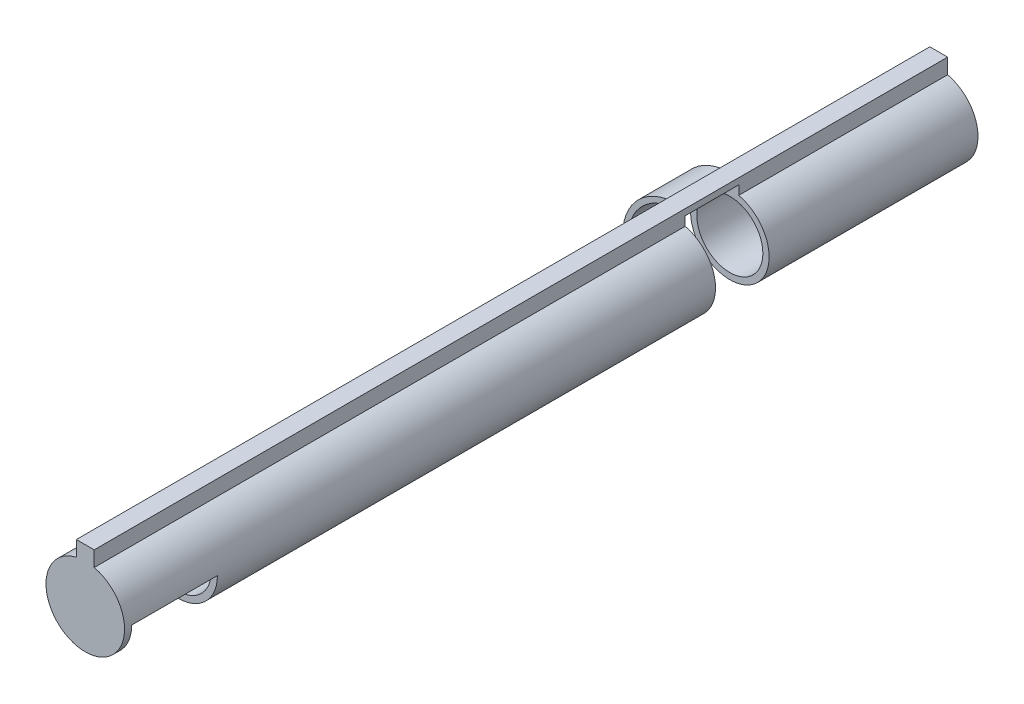
ISO-10303-21;
HEADER;
FILE_DESCRIPTION(('STEP AP214'),'2;1');
FILE_NAME('part.step','',(''),(''),'','','');
FILE_SCHEMA(('AUTOMOTIVE_DESIGN { 1 0 10303 214 1 1 1 1 }'));
ENDSEC;
DATA;
#1=APPLICATION_CONTEXT('core data for automotive mechanical design processes');
#2=APPLICATION_PROTOCOL_DEFINITION('international standard','automotive_design',2000,#1);
#3=PRODUCT_CONTEXT('',#1,'mechanical');
#4=PRODUCT('Part','Part','',(#3));
#5=PRODUCT_RELATED_PRODUCT_CATEGORY('part','',(#4));
#6=PRODUCT_DEFINITION_FORMATION('','',#4);
#7=PRODUCT_DEFINITION_CONTEXT('part definition',#1,'design');
#8=PRODUCT_DEFINITION('design','',#6,#7);
#9=PRODUCT_DEFINITION_SHAPE('','',#8);
#10=(LENGTH_UNIT() NAMED_UNIT(*) SI_UNIT(.MILLI.,.METRE.));
#11=(NAMED_UNIT(*) PLANE_ANGLE_UNIT() SI_UNIT($,.RADIAN.));
#12=(NAMED_UNIT(*) SI_UNIT($,.STERADIAN.) SOLID_ANGLE_UNIT());
#13=UNCERTAINTY_MEASURE_WITH_UNIT(LENGTH_MEASURE(1.E-05),#10,'distance_accuracy_value','');
#14=(GEOMETRIC_REPRESENTATION_CONTEXT(3) GLOBAL_UNCERTAINTY_ASSIGNED_CONTEXT((#13)) GLOBAL_UNIT_ASSIGNED_CONTEXT((#10,
#11,#12)) REPRESENTATION_CONTEXT('',''));
#15=CARTESIAN_POINT('',(0.,0.,0.));
#16=DIRECTION('',(0.,0.,1.));
#17=DIRECTION('',(1.,0.,0.));
#18=AXIS2_PLACEMENT_3D('',#15,#16,#17);
#19=CARTESIAN_POINT('',(0.,0.,213.));
#20=DIRECTION('',(0.,0.,1.));
#21=DIRECTION('',(1.,0.,0.));
#22=AXIS2_PLACEMENT_3D('',#19,#20,#21);
#23=PLANE('',#22);
#24=CARTESIAN_POINT('',(0.,0.,213.));
#25=DIRECTION('',(0.,0.,1.));
#26=DIRECTION('',(1.,0.,0.));
#27=AXIS2_PLACEMENT_3D('',#24,#25,#26);
#28=CIRCLE('',#27,6.5);
#29=CARTESIAN_POINT('',(5.61707828518173,3.27084569158189,213.));
#30=VERTEX_POINT('',#29);
#31=CARTESIAN_POINT('',(-3.27084569158189,-5.61707828518173,213.));
#32=VERTEX_POINT('',#31);
#33=EDGE_CURVE('E234',#30,#32,#28,.T.);
#34=ORIENTED_EDGE('',*,*,#33,.F.);
#35=CARTESIAN_POINT('',(12.5304054054054,7.29650192737499,213.));
#36=DIRECTION('',(0.,0.,1.));
#37=DIRECTION('',(1.,0.,0.));
#38=AXIS2_PLACEMENT_3D('',#35,#36,#37);
#39=CIRCLE('',#38,8.);
#40=CARTESIAN_POINT('',(9.25,0.,213.));
#41=VERTEX_POINT('',#40);
#42=EDGE_CURVE('E11',#30,#41,#39,.T.);
#43=ORIENTED_EDGE('',*,*,#42,.T.);
#44=CARTESIAN_POINT('',(0.,0.,213.));
#45=DIRECTION('',(0.,0.,1.));
#46=DIRECTION('',(1.,0.,0.));
#47=AXIS2_PLACEMENT_3D('',#44,#45,#46);
#48=CIRCLE('',#47,9.25);
#49=CARTESIAN_POINT('',(0.,-9.25,213.));
#50=VERTEX_POINT('',#49);
#51=EDGE_CURVE('E183',#41,#50,#48,.T.);
#52=ORIENTED_EDGE('',*,*,#51,.T.);
#53=CARTESIAN_POINT('',(-7.29650192737499,-12.5304054054054,213.));
#54=DIRECTION('',(0.,0.,1.));
#55=DIRECTION('',(1.,0.,0.));
#56=AXIS2_PLACEMENT_3D('',#53,#54,#55);
#57=CIRCLE('',#56,8.);
#58=EDGE_CURVE('E42',#50,#32,#57,.T.);
#59=ORIENTED_EDGE('',*,*,#58,.T.);
#60=EDGE_LOOP('',(#34,#43,#52,#59));
#61=FACE_BOUND('',#60,.T.);
#62=ADVANCED_FACE('F34',(#61),#23,.T.);
#63=CARTESIAN_POINT('',(-2.5,10.7121426428143,245.58678379147));
#64=DIRECTION('',(1.,0.,0.));
#65=DIRECTION('',(0.,0.,-1.));
#66=AXIS2_PLACEMENT_3D('',#63,#64,#65);
#67=PLANE('',#66);
#68=DIRECTION('',(0.,-1.,0.));
#69=VECTOR('',#68,1.);
#70=CARTESIAN_POINT('',(-2.5,10.7121426428143,58.5));
#71=LINE('',#70,#69);
#72=CARTESIAN_POINT('',(-2.5,14.790199457749,58.5));
#73=VERTEX_POINT('',#72);
#74=CARTESIAN_POINT('',(-2.5,13.2664991614216,58.5));
#75=VERTEX_POINT('',#74);
#76=EDGE_CURVE('E314',#73,#75,#71,.T.);
#77=ORIENTED_EDGE('',*,*,#76,.F.);
#78=DIRECTION('',(0.,0.,1.));
#79=VECTOR('',#78,1.);
#80=CARTESIAN_POINT('',(-2.5,14.790199457749,58.5));
#81=LINE('',#80,#79);
#82=CARTESIAN_POINT('',(-2.5,14.790199457749,73.5));
#83=VERTEX_POINT('',#82);
#84=EDGE_CURVE('E310',#73,#83,#81,.T.);
#85=ORIENTED_EDGE('',*,*,#84,.T.);
#86=DIRECTION('',(0.,-1.,0.));
#87=VECTOR('',#86,1.);
#88=CARTESIAN_POINT('',(-2.5,10.7121426428143,73.5));
#89=LINE('',#88,#87);
#90=CARTESIAN_POINT('',(-2.5,13.2664991614216,73.5));
#91=VERTEX_POINT('',#90);
#92=EDGE_CURVE('E317',#83,#91,#89,.T.);
#93=ORIENTED_EDGE('',*,*,#92,.T.);
#94=DIRECTION('',(0.,-1.,0.));
#95=VECTOR('',#94,1.);
#96=CARTESIAN_POINT('',(-2.5,10.7121426428143,73.5));
#97=LINE('',#96,#95);
#98=CARTESIAN_POINT('',(-2.5,10.7121426428143,73.5));
#99=VERTEX_POINT('',#98);
#100=EDGE_CURVE('E301',#91,#99,#97,.T.);
#101=ORIENTED_EDGE('',*,*,#100,.T.);
#102=DIRECTION('',(0.,0.,-1.));
#103=VECTOR('',#102,1.);
#104=CARTESIAN_POINT('',(-2.5,10.7121426428143,245.58678379147));
#105=LINE('',#104,#103);
#106=CARTESIAN_POINT('',(-2.5,10.7121426428143,239.));
#107=VERTEX_POINT('',#106);
#108=EDGE_CURVE('E270',#107,#99,#105,.T.);
#109=ORIENTED_EDGE('',*,*,#108,.F.);
#110=DIRECTION('',(0.,-1.,0.));
#111=VECTOR('',#110,1.);
#112=CARTESIAN_POINT('',(-2.5,10.7121426428143,239.));
#113=LINE('',#112,#111);
#114=CARTESIAN_POINT('',(-2.5,15.,239.));
#115=VERTEX_POINT('',#114);
#116=EDGE_CURVE('E261',#115,#107,#113,.T.);
#117=ORIENTED_EDGE('',*,*,#116,.F.);
#118=DIRECTION('',(0.,0.,-1.));
#119=VECTOR('',#118,1.);
#120=CARTESIAN_POINT('',(-2.5,15.,245.58678379147));
#121=LINE('',#120,#119);
#122=CARTESIAN_POINT('',(-2.5,15.,0.));
#123=VERTEX_POINT('',#122);
#124=EDGE_CURVE('E274',#115,#123,#121,.T.);
#125=ORIENTED_EDGE('',*,*,#124,.T.);
#126=DIRECTION('',(0.,-1.,0.));
#127=VECTOR('',#126,1.);
#128=CARTESIAN_POINT('',(-2.5,10.7121426428143,0.));
#129=LINE('',#128,#127);
#130=CARTESIAN_POINT('',(-2.5,10.7121426428143,0.));
#131=VERTEX_POINT('',#130);
#132=EDGE_CURVE('E276',#123,#131,#129,.T.);
#133=ORIENTED_EDGE('',*,*,#132,.T.);
#134=CARTESIAN_POINT('',(-2.5,10.7121426428143,58.5));
#135=VERTEX_POINT('',#134);
#136=EDGE_CURVE('E273',#135,#131,#105,.T.);
#137=ORIENTED_EDGE('',*,*,#136,.F.);
#138=DIRECTION('',(0.,-1.,0.));
#139=VECTOR('',#138,1.);
#140=CARTESIAN_POINT('',(-2.5,10.7121426428143,58.5));
#141=LINE('',#140,#139);
#142=EDGE_CURVE('E294',#75,#135,#141,.T.);
#143=ORIENTED_EDGE('',*,*,#142,.F.);
#144=EDGE_LOOP('',(#77,#85,#93,#101,#109,#117,#125,#133,#137,#143));
#145=FACE_BOUND('',#144,.T.);
#146=ADVANCED_FACE('F355',(#145),#67,.F.);
#147=CARTESIAN_POINT('',(0.,0.,210.));
#148=DIRECTION('',(0.,0.,-1.));
#149=DIRECTION('',(-1.,0.,0.));
#150=AXIS2_PLACEMENT_3D('',#147,#148,#149);
#151=CYLINDRICAL_SURFACE('',#150,11.);
#152=CARTESIAN_POINT('',(0.,0.,58.5));
#153=DIRECTION('',(0.,0.,1.));
#154=DIRECTION('',(1.,0.,0.));
#155=AXIS2_PLACEMENT_3D('',#152,#153,#154);
#156=CIRCLE('',#155,11.);
#157=CARTESIAN_POINT('',(2.5,10.7121426428143,58.5));
#158=VERTEX_POINT('',#157);
#159=EDGE_CURVE('E296',#135,#158,#156,.T.);
#160=ORIENTED_EDGE('',*,*,#159,.F.);
#161=ORIENTED_EDGE('',*,*,#136,.T.);
#162=CARTESIAN_POINT('',(0.,0.,0.));
#163=DIRECTION('',(0.,0.,1.));
#164=DIRECTION('',(1.,0.,0.));
#165=AXIS2_PLACEMENT_3D('',#162,#163,#164);
#166=CIRCLE('',#165,11.);
#167=CARTESIAN_POINT('',(2.5,10.7121426428143,0.));
#168=VERTEX_POINT('',#167);
#169=EDGE_CURVE('E212',#131,#168,#166,.T.);
#170=ORIENTED_EDGE('',*,*,#169,.T.);
#171=DIRECTION('',(0.,0.,-1.));
#172=VECTOR('',#171,1.);
#173=CARTESIAN_POINT('',(2.5,10.7121426428143,245.58678379147));
#174=LINE('',#173,#172);
#175=EDGE_CURVE('E269',#158,#168,#174,.T.);
#176=ORIENTED_EDGE('',*,*,#175,.F.);
#177=EDGE_LOOP('',(#160,#161,#170,#176));
#178=FACE_BOUND('',#177,.T.);
#179=ADVANCED_FACE('F360',(#178),#151,.T.);
#180=CARTESIAN_POINT('',(0.,0.,210.));
#181=DIRECTION('',(0.,0.,-1.));
#182=DIRECTION('',(-1.,0.,0.));
#183=AXIS2_PLACEMENT_3D('',#180,#181,#182);
#184=CYLINDRICAL_SURFACE('',#183,9.25);
#185=CARTESIAN_POINT('',(0.,0.,0.));
#186=DIRECTION('',(0.,0.,1.));
#187=DIRECTION('',(1.,0.,0.));
#188=AXIS2_PLACEMENT_3D('',#185,#186,#187);
#189=CIRCLE('',#188,9.25);
#190=CARTESIAN_POINT('',(9.25,0.,0.));
#191=VERTEX_POINT('',#190);
#192=EDGE_CURVE('E205',#191,#191,#189,.T.);
#193=ORIENTED_EDGE('',*,*,#192,.F.);
#194=EDGE_LOOP('',(#193));
#195=FACE_BOUND('',#194,.T.);
#196=CARTESIAN_POINT('',(0.,0.,58.5));
#197=DIRECTION('',(0.,0.,1.));
#198=DIRECTION('',(1.,0.,0.));
#199=AXIS2_PLACEMENT_3D('',#196,#197,#198);
#200=CIRCLE('',#199,9.25);
#201=CARTESIAN_POINT('',(9.25,0.,58.5));
#202=VERTEX_POINT('',#201);
#203=EDGE_CURVE('E280',#202,#202,#200,.T.);
#204=ORIENTED_EDGE('',*,*,#203,.T.);
#205=EDGE_LOOP('',(#204));
#206=FACE_BOUND('',#205,.T.);
#207=ADVANCED_FACE('F379',(#195,#206),#184,.F.);
#208=CARTESIAN_POINT('',(2.5,10.7121426428143,245.58678379147));
#209=DIRECTION('',(-1.,0.,0.));
#210=DIRECTION('',(0.,0.,1.));
#211=AXIS2_PLACEMENT_3D('',#208,#209,#210);
#212=PLANE('',#211);
#213=DIRECTION('',(0.,1.,0.));
#214=VECTOR('',#213,1.);
#215=CARTESIAN_POINT('',(2.5,10.7121426428143,58.5));
#216=LINE('',#215,#214);
#217=CARTESIAN_POINT('',(2.5,13.2664991614216,58.5));
#218=VERTEX_POINT('',#217);
#219=EDGE_CURVE('E224',#158,#218,#216,.T.);
#220=ORIENTED_EDGE('',*,*,#219,.F.);
#221=ORIENTED_EDGE('',*,*,#175,.T.);
#222=DIRECTION('',(0.,1.,0.));
#223=VECTOR('',#222,1.);
#224=CARTESIAN_POINT('',(2.5,10.7121426428143,0.));
#225=LINE('',#224,#223);
#226=CARTESIAN_POINT('',(2.5,15.,0.));
#227=VERTEX_POINT('',#226);
#228=EDGE_CURVE('E268',#168,#227,#225,.T.);
#229=ORIENTED_EDGE('',*,*,#228,.T.);
#230=DIRECTION('',(0.,0.,-1.));
#231=VECTOR('',#230,1.);
#232=CARTESIAN_POINT('',(2.5,15.,245.58678379147));
#233=LINE('',#232,#231);
#234=CARTESIAN_POINT('',(2.5,15.,239.));
#235=VERTEX_POINT('',#234);
#236=EDGE_CURVE('E278',#235,#227,#233,.T.);
#237=ORIENTED_EDGE('',*,*,#236,.F.);
#238=DIRECTION('',(0.,1.,0.));
#239=VECTOR('',#238,1.);
#240=CARTESIAN_POINT('',(2.5,10.7121426428143,239.));
#241=LINE('',#240,#239);
#242=CARTESIAN_POINT('',(2.5,10.7121426428143,239.));
#243=VERTEX_POINT('',#242);
#244=EDGE_CURVE('E281',#243,#235,#241,.T.);
#245=ORIENTED_EDGE('',*,*,#244,.F.);
#246=CARTESIAN_POINT('',(2.5,10.7121426428143,73.5));
#247=VERTEX_POINT('',#246);
#248=EDGE_CURVE('E265',#243,#247,#174,.T.);
#249=ORIENTED_EDGE('',*,*,#248,.T.);
#250=DIRECTION('',(0.,1.,0.));
#251=VECTOR('',#250,1.);
#252=CARTESIAN_POINT('',(2.5,10.7121426428143,73.5));
#253=LINE('',#252,#251);
#254=CARTESIAN_POINT('',(2.5,13.2664991614216,73.5));
#255=VERTEX_POINT('',#254);
#256=EDGE_CURVE('E218',#247,#255,#253,.T.);
#257=ORIENTED_EDGE('',*,*,#256,.T.);
#258=DIRECTION('',(0.,0.,1.));
#259=VECTOR('',#258,1.);
#260=CARTESIAN_POINT('',(2.5,13.2664991614216,58.5));
#261=LINE('',#260,#259);
#262=EDGE_CURVE('E221',#255,#218,#261,.F.);
#263=ORIENTED_EDGE('',*,*,#262,.T.);
#264=EDGE_LOOP('',(#220,#221,#229,#237,#245,#249,#257,#263));
#265=FACE_BOUND('',#264,.T.);
#266=ADVANCED_FACE('F383',(#265),#212,.F.);
#267=DIRECTION('',(0.,0.,-1.));
#268=VECTOR('',#267,1.);
#269=CARTESIAN_POINT('',(11.,0.,237.));
#270=LINE('',#269,#268);
#271=CARTESIAN_POINT('',(11.,0.,237.));
#272=VERTEX_POINT('',#271);
#273=CARTESIAN_POINT('',(11.,0.,213.));
#274=VERTEX_POINT('',#273);
#275=EDGE_CURVE('E207',#272,#274,#270,.T.);
#276=ORIENTED_EDGE('',*,*,#275,.T.);
#277=CARTESIAN_POINT('',(0.,0.,213.));
#278=DIRECTION('',(0.,0.,1.));
#279=DIRECTION('',(1.,0.,0.));
#280=AXIS2_PLACEMENT_3D('',#277,#278,#279);
#281=CIRCLE('',#280,11.);
#282=CARTESIAN_POINT('',(0.,-11.,213.));
#283=VERTEX_POINT('',#282);
#284=EDGE_CURVE('E188',#283,#274,#281,.T.);
#285=ORIENTED_EDGE('',*,*,#284,.F.);
#286=DIRECTION('',(0.,0.,-1.));
#287=VECTOR('',#286,1.);
#288=CARTESIAN_POINT('',(0.,-11.,237.));
#289=LINE('',#288,#287);
#290=CARTESIAN_POINT('',(0.,-11.,237.));
#291=VERTEX_POINT('',#290);
#292=EDGE_CURVE('E196',#291,#283,#289,.T.);
#293=ORIENTED_EDGE('',*,*,#292,.F.);
#294=CARTESIAN_POINT('',(0.,0.,237.));
#295=DIRECTION('',(0.,0.,1.));
#296=DIRECTION('',(1.,0.,0.));
#297=AXIS2_PLACEMENT_3D('',#294,#295,#296);
#298=CIRCLE('',#297,11.);
#299=EDGE_CURVE('E241',#291,#272,#298,.T.);
#300=ORIENTED_EDGE('',*,*,#299,.T.);
#301=EDGE_LOOP('',(#276,#285,#293,#300));
#302=FACE_BOUND('',#301,.T.);
#303=ORIENTED_EDGE('',*,*,#108,.T.);
#304=CARTESIAN_POINT('',(0.,0.,73.5));
#305=DIRECTION('',(0.,0.,1.));
#306=DIRECTION('',(1.,0.,0.));
#307=AXIS2_PLACEMENT_3D('',#304,#305,#306);
#308=CIRCLE('',#307,11.);
#309=EDGE_CURVE('E304',#99,#247,#308,.T.);
#310=ORIENTED_EDGE('',*,*,#309,.T.);
#311=ORIENTED_EDGE('',*,*,#248,.F.);
#312=CARTESIAN_POINT('',(0.,0.,239.));
#313=DIRECTION('',(0.,0.,1.));
#314=DIRECTION('',(1.,0.,0.));
#315=AXIS2_PLACEMENT_3D('',#312,#313,#314);
#316=CIRCLE('',#315,11.);
#317=EDGE_CURVE('E237',#107,#243,#316,.T.);
#318=ORIENTED_EDGE('',*,*,#317,.F.);
#319=EDGE_LOOP('',(#303,#310,#311,#318));
#320=FACE_BOUND('',#319,.T.);
#321=ADVANCED_FACE('F253',(#302,#320),#151,.T.);
#322=CARTESIAN_POINT('',(0.,0.,73.5));
#323=DIRECTION('',(0.,0.,1.));
#324=DIRECTION('',(1.,0.,0.));
#325=AXIS2_PLACEMENT_3D('',#322,#323,#324);
#326=CIRCLE('',#325,9.25);
#327=CARTESIAN_POINT('',(9.25,0.,73.5));
#328=VERTEX_POINT('',#327);
#329=EDGE_CURVE('E298',#328,#328,#326,.T.);
#330=ORIENTED_EDGE('',*,*,#329,.F.);
#331=EDGE_LOOP('',(#330));
#332=FACE_BOUND('',#331,.T.);
#333=CARTESIAN_POINT('',(0.,0.,210.));
#334=DIRECTION('',(0.,0.,1.));
#335=DIRECTION('',(1.,0.,0.));
#336=AXIS2_PLACEMENT_3D('',#333,#334,#335);
#337=CIRCLE('',#336,9.25);
#338=CARTESIAN_POINT('',(9.25,0.,210.));
#339=VERTEX_POINT('',#338);
#340=CARTESIAN_POINT('',(0.,-9.25,210.));
#341=VERTEX_POINT('',#340);
#342=EDGE_CURVE('E171',#339,#341,#337,.T.);
#343=ORIENTED_EDGE('',*,*,#342,.T.);
#344=DIRECTION('',(0.,0.,-1.));
#345=VECTOR('',#344,1.);
#346=CARTESIAN_POINT('',(0.,-9.25,226.081475451951));
#347=LINE('',#346,#345);
#348=EDGE_CURVE('E160',#50,#341,#347,.T.);
#349=ORIENTED_EDGE('',*,*,#348,.F.);
#350=CARTESIAN_POINT('',(0.,0.,213.));
#351=DIRECTION('',(0.,0.,1.));
#352=DIRECTION('',(1.,0.,0.));
#353=AXIS2_PLACEMENT_3D('',#350,#351,#352);
#354=CIRCLE('',#353,9.25);
#355=EDGE_CURVE('E168',#41,#50,#354,.F.);
#356=ORIENTED_EDGE('',*,*,#355,.F.);
#357=DIRECTION('',(0.,0.,-1.));
#358=VECTOR('',#357,1.);
#359=CARTESIAN_POINT('',(9.25,0.,226.081475451951));
#360=LINE('',#359,#358);
#361=EDGE_CURVE('E172',#41,#339,#360,.T.);
#362=ORIENTED_EDGE('',*,*,#361,.T.);
#363=EDGE_LOOP('',(#343,#349,#356,#362));
#364=FACE_BOUND('',#363,.T.);
#365=ADVANCED_FACE('F166',(#332,#364),#184,.F.);
#366=CARTESIAN_POINT('',(0.,0.,0.));
#367=DIRECTION('',(0.,0.,1.));
#368=DIRECTION('',(1.,0.,0.));
#369=AXIS2_PLACEMENT_3D('',#366,#367,#368);
#370=PLANE('',#369);
#371=ORIENTED_EDGE('',*,*,#228,.F.);
#372=ORIENTED_EDGE('',*,*,#169,.F.);
#373=ORIENTED_EDGE('',*,*,#132,.F.);
#374=DIRECTION('',(-1.,0.,0.));
#375=VECTOR('',#374,1.);
#376=CARTESIAN_POINT('',(-2.5,15.,0.));
#377=LINE('',#376,#375);
#378=EDGE_CURVE('E277',#227,#123,#377,.T.);
#379=ORIENTED_EDGE('',*,*,#378,.F.);
#380=EDGE_LOOP('',(#371,#372,#373,#379));
#381=FACE_BOUND('',#380,.T.);
#382=ORIENTED_EDGE('',*,*,#192,.T.);
#383=EDGE_LOOP('',(#382));
#384=FACE_BOUND('',#383,.T.);
#385=ADVANCED_FACE('F378',(#381,#384),#370,.F.);
#386=ORIENTED_EDGE('',*,*,#51,.F.);
#387=DIRECTION('',(0.,0.,-1.));
#388=VECTOR('',#387,1.);
#389=CARTESIAN_POINT('',(9.25,0.,237.));
#390=LINE('',#389,#388);
#391=CARTESIAN_POINT('',(9.25,0.,237.));
#392=VERTEX_POINT('',#391);
#393=EDGE_CURVE('E203',#392,#41,#390,.T.);
#394=ORIENTED_EDGE('',*,*,#393,.F.);
#395=CARTESIAN_POINT('',(0.,0.,237.));
#396=DIRECTION('',(0.,0.,-1.));
#397=DIRECTION('',(-1.,0.,0.));
#398=AXIS2_PLACEMENT_3D('',#395,#396,#397);
#399=CIRCLE('',#398,9.25);
#400=CARTESIAN_POINT('',(0.,-9.25,237.));
#401=VERTEX_POINT('',#400);
#402=EDGE_CURVE('E201',#401,#392,#399,.T.);
#403=ORIENTED_EDGE('',*,*,#402,.F.);
#404=DIRECTION('',(0.,0.,-1.));
#405=VECTOR('',#404,1.);
#406=CARTESIAN_POINT('',(0.,-9.25,237.));
#407=LINE('',#406,#405);
#408=EDGE_CURVE('E193',#401,#50,#407,.T.);
#409=ORIENTED_EDGE('',*,*,#408,.T.);
#410=EDGE_LOOP('',(#386,#394,#403,#409));
#411=FACE_BOUND('',#410,.T.);
#412=ADVANCED_FACE('F199',(#411),#184,.F.);
#413=CARTESIAN_POINT('',(0.,-9.25,237.));
#414=DIRECTION('',(-1.,0.,0.));
#415=DIRECTION('',(0.,-1.,0.));
#416=AXIS2_PLACEMENT_3D('',#413,#414,#415);
#417=PLANE('',#416);
#418=ORIENTED_EDGE('',*,*,#292,.T.);
#419=DIRECTION('',(0.,1.,0.));
#420=VECTOR('',#419,1.);
#421=CARTESIAN_POINT('',(0.,-9.25,213.));
#422=LINE('',#421,#420);
#423=EDGE_CURVE('E177',#283,#50,#422,.T.);
#424=ORIENTED_EDGE('',*,*,#423,.T.);
#425=ORIENTED_EDGE('',*,*,#408,.F.);
#426=DIRECTION('',(0.,1.,0.));
#427=VECTOR('',#426,1.);
#428=CARTESIAN_POINT('',(0.,-9.25,237.));
#429=LINE('',#428,#427);
#430=EDGE_CURVE('E197',#291,#401,#429,.T.);
#431=ORIENTED_EDGE('',*,*,#430,.F.);
#432=EDGE_LOOP('',(#418,#424,#425,#431));
#433=FACE_BOUND('',#432,.T.);
#434=ADVANCED_FACE('F192',(#433),#417,.F.);
#435=CARTESIAN_POINT('',(9.25,0.,237.));
#436=DIRECTION('',(0.,1.,0.));
#437=DIRECTION('',(0.,0.,1.));
#438=AXIS2_PLACEMENT_3D('',#435,#436,#437);
#439=PLANE('',#438);
#440=ORIENTED_EDGE('',*,*,#393,.T.);
#441=DIRECTION('',(1.,0.,0.));
#442=VECTOR('',#441,1.);
#443=CARTESIAN_POINT('',(9.25,0.,213.));
#444=LINE('',#443,#442);
#445=EDGE_CURVE('E180',#41,#274,#444,.T.);
#446=ORIENTED_EDGE('',*,*,#445,.T.);
#447=ORIENTED_EDGE('',*,*,#275,.F.);
#448=DIRECTION('',(1.,0.,0.));
#449=VECTOR('',#448,1.);
#450=CARTESIAN_POINT('',(9.25,0.,237.));
#451=LINE('',#450,#449);
#452=EDGE_CURVE('E248',#392,#272,#451,.T.);
#453=ORIENTED_EDGE('',*,*,#452,.F.);
#454=EDGE_LOOP('',(#440,#446,#447,#453));
#455=FACE_BOUND('',#454,.T.);
#456=ADVANCED_FACE('F258',(#455),#439,.F.);
#457=ORIENTED_EDGE('',*,*,#355,.T.);
#458=ORIENTED_EDGE('',*,*,#423,.F.);
#459=ORIENTED_EDGE('',*,*,#284,.T.);
#460=ORIENTED_EDGE('',*,*,#445,.F.);
#461=EDGE_LOOP('',(#457,#458,#459,#460));
#462=FACE_BOUND('',#461,.T.);
#463=ADVANCED_FACE('F175',(#462),#23,.T.);
#464=CARTESIAN_POINT('',(0.,0.,210.));
#465=DIRECTION('',(0.,0.,1.));
#466=DIRECTION('',(1.,0.,0.));
#467=AXIS2_PLACEMENT_3D('',#464,#465,#466);
#468=PLANE('',#467);
#469=ORIENTED_EDGE('',*,*,#342,.F.);
#470=CARTESIAN_POINT('',(12.5304054054054,7.29650192737499,210.));
#471=DIRECTION('',(0.,0.,1.));
#472=DIRECTION('',(1.,0.,0.));
#473=AXIS2_PLACEMENT_3D('',#470,#471,#472);
#474=CIRCLE('',#473,8.);
#475=CARTESIAN_POINT('',(5.61707828518173,3.27084569158189,210.));
#476=VERTEX_POINT('',#475);
#477=EDGE_CURVE('E228',#339,#476,#474,.F.);
#478=ORIENTED_EDGE('',*,*,#477,.T.);
#479=CARTESIAN_POINT('',(0.,0.,210.));
#480=DIRECTION('',(0.,0.,1.));
#481=DIRECTION('',(1.,0.,0.));
#482=AXIS2_PLACEMENT_3D('',#479,#480,#481);
#483=CIRCLE('',#482,6.5);
#484=CARTESIAN_POINT('',(-3.27084569158189,-5.61707828518173,210.));
#485=VERTEX_POINT('',#484);
#486=EDGE_CURVE('E233',#476,#485,#483,.T.);
#487=ORIENTED_EDGE('',*,*,#486,.T.);
#488=CARTESIAN_POINT('',(-7.29650192737499,-12.5304054054054,210.));
#489=DIRECTION('',(0.,0.,1.));
#490=DIRECTION('',(1.,0.,0.));
#491=AXIS2_PLACEMENT_3D('',#488,#489,#490);
#492=CIRCLE('',#491,8.);
#493=EDGE_CURVE('E226',#485,#341,#492,.F.);
#494=ORIENTED_EDGE('',*,*,#493,.T.);
#495=EDGE_LOOP('',(#469,#478,#487,#494));
#496=FACE_BOUND('',#495,.T.);
#497=ADVANCED_FACE('F236',(#496),#468,.F.);
#498=CARTESIAN_POINT('',(0.,0.,213.));
#499=DIRECTION('',(0.,0.,-1.));
#500=DIRECTION('',(-1.,0.,0.));
#501=AXIS2_PLACEMENT_3D('',#498,#499,#500);
#502=CYLINDRICAL_SURFACE('',#501,6.5);
#503=ORIENTED_EDGE('',*,*,#486,.F.);
#504=DIRECTION('',(0.,0.,-1.));
#505=VECTOR('',#504,1.);
#506=CARTESIAN_POINT('',(5.61707828518174,3.27084569158189,213.));
#507=LINE('',#506,#505);
#508=EDGE_CURVE('E55',#476,#30,#507,.F.);
#509=ORIENTED_EDGE('',*,*,#508,.T.);
#510=ORIENTED_EDGE('',*,*,#33,.T.);
#511=DIRECTION('',(0.,0.,-1.));
#512=VECTOR('',#511,1.);
#513=CARTESIAN_POINT('',(-3.27084569158189,-5.61707828518174,213.));
#514=LINE('',#513,#512);
#515=EDGE_CURVE('E161',#32,#485,#514,.T.);
#516=ORIENTED_EDGE('',*,*,#515,.T.);
#517=EDGE_LOOP('',(#503,#509,#510,#516));
#518=FACE_BOUND('',#517,.T.);
#519=ADVANCED_FACE('F232',(#518),#502,.F.);
#520=CARTESIAN_POINT('',(0.,0.,237.));
#521=DIRECTION('',(0.,0.,1.));
#522=DIRECTION('',(1.,0.,0.));
#523=AXIS2_PLACEMENT_3D('',#520,#521,#522);
#524=PLANE('',#523);
#525=ORIENTED_EDGE('',*,*,#299,.F.);
#526=ORIENTED_EDGE('',*,*,#430,.T.);
#527=ORIENTED_EDGE('',*,*,#402,.T.);
#528=ORIENTED_EDGE('',*,*,#452,.T.);
#529=EDGE_LOOP('',(#525,#526,#527,#528));
#530=FACE_BOUND('',#529,.T.);
#531=ADVANCED_FACE('F260',(#530),#524,.F.);
#532=CARTESIAN_POINT('',(0.,0.,239.));
#533=DIRECTION('',(0.,0.,1.));
#534=DIRECTION('',(1.,0.,0.));
#535=AXIS2_PLACEMENT_3D('',#532,#533,#534);
#536=PLANE('',#535);
#537=ORIENTED_EDGE('',*,*,#317,.T.);
#538=ORIENTED_EDGE('',*,*,#244,.T.);
#539=DIRECTION('',(-1.,0.,0.));
#540=VECTOR('',#539,1.);
#541=CARTESIAN_POINT('',(-2.5,15.,239.));
#542=LINE('',#541,#540);
#543=EDGE_CURVE('E262',#235,#115,#542,.T.);
#544=ORIENTED_EDGE('',*,*,#543,.T.);
#545=ORIENTED_EDGE('',*,*,#116,.T.);
#546=EDGE_LOOP('',(#537,#538,#544,#545));
#547=FACE_BOUND('',#546,.T.);
#548=ADVANCED_FACE('F435',(#547),#536,.T.);
#549=CARTESIAN_POINT('',(-2.5,15.,245.58678379147));
#550=DIRECTION('',(0.,-1.,0.));
#551=DIRECTION('',(0.,0.,-1.));
#552=AXIS2_PLACEMENT_3D('',#549,#550,#551);
#553=PLANE('',#552);
#554=ORIENTED_EDGE('',*,*,#543,.F.);
#555=ORIENTED_EDGE('',*,*,#236,.T.);
#556=ORIENTED_EDGE('',*,*,#378,.T.);
#557=ORIENTED_EDGE('',*,*,#124,.F.);
#558=EDGE_LOOP('',(#554,#555,#556,#557));
#559=FACE_BOUND('',#558,.T.);
#560=ADVANCED_FACE('F437',(#559),#553,.F.);
#561=CARTESIAN_POINT('',(0.,0.,58.5));
#562=DIRECTION('',(0.,0.,1.));
#563=DIRECTION('',(1.,0.,0.));
#564=AXIS2_PLACEMENT_3D('',#561,#562,#563);
#565=CYLINDRICAL_SURFACE('',#564,13.5);
#566=CARTESIAN_POINT('',(0.,0.,73.5));
#567=DIRECTION('',(0.,0.,1.));
#568=DIRECTION('',(1.,0.,0.));
#569=AXIS2_PLACEMENT_3D('',#566,#567,#568);
#570=CIRCLE('',#569,13.5);
#571=EDGE_CURVE('E308',#255,#91,#570,.T.);
#572=ORIENTED_EDGE('',*,*,#571,.T.);
#573=CARTESIAN_POINT('',(0.,0.,73.5));
#574=DIRECTION('',(0.,0.,-1.));
#575=DIRECTION('',(1.,0.,0.));
#576=AXIS2_PLACEMENT_3D('',#573,#574,#575);
#577=CIRCLE('',#576,13.5);
#578=CARTESIAN_POINT('',(-13.5,0.,73.5));
#579=VERTEX_POINT('',#578);
#580=EDGE_CURVE('E326',#579,#91,#577,.T.);
#581=ORIENTED_EDGE('',*,*,#580,.F.);
#582=DIRECTION('',(0.,0.,1.));
#583=VECTOR('',#582,1.);
#584=CARTESIAN_POINT('',(-13.5,0.,58.5));
#585=LINE('',#584,#583);
#586=CARTESIAN_POINT('',(-13.5,0.,58.5));
#587=VERTEX_POINT('',#586);
#588=EDGE_CURVE('E320',#587,#579,#585,.T.);
#589=ORIENTED_EDGE('',*,*,#588,.F.);
#590=CARTESIAN_POINT('',(0.,0.,58.5));
#591=DIRECTION('',(0.,0.,-1.));
#592=DIRECTION('',(1.,0.,0.));
#593=AXIS2_PLACEMENT_3D('',#590,#591,#592);
#594=CIRCLE('',#593,13.5);
#595=EDGE_CURVE('E324',#587,#75,#594,.T.);
#596=ORIENTED_EDGE('',*,*,#595,.T.);
#597=CARTESIAN_POINT('',(0.,0.,58.5));
#598=DIRECTION('',(0.,0.,1.));
#599=DIRECTION('',(1.,0.,0.));
#600=AXIS2_PLACEMENT_3D('',#597,#598,#599);
#601=CIRCLE('',#600,13.5);
#602=EDGE_CURVE('E307',#218,#75,#601,.T.);
#603=ORIENTED_EDGE('',*,*,#602,.F.);
#604=ORIENTED_EDGE('',*,*,#262,.F.);
#605=EDGE_LOOP('',(#572,#581,#589,#596,#603,#604));
#606=FACE_BOUND('',#605,.T.);
#607=ADVANCED_FACE('F415',(#606),#565,.F.);
#608=CARTESIAN_POINT('',(0.,0.,58.5));
#609=DIRECTION('',(0.,0.,1.));
#610=DIRECTION('',(1.,0.,0.));
#611=AXIS2_PLACEMENT_3D('',#608,#609,#610);
#612=PLANE('',#611);
#613=ORIENTED_EDGE('',*,*,#203,.F.);
#614=EDGE_LOOP('',(#613));
#615=FACE_BOUND('',#614,.T.);
#616=ORIENTED_EDGE('',*,*,#142,.T.);
#617=ORIENTED_EDGE('',*,*,#159,.T.);
#618=ORIENTED_EDGE('',*,*,#219,.T.);
#619=ORIENTED_EDGE('',*,*,#602,.T.);
#620=EDGE_LOOP('',(#616,#617,#618,#619));
#621=FACE_BOUND('',#620,.T.);
#622=ADVANCED_FACE('F413',(#615,#621),#612,.T.);
#623=CARTESIAN_POINT('',(0.,0.,73.5));
#624=DIRECTION('',(0.,0.,1.));
#625=DIRECTION('',(1.,0.,0.));
#626=AXIS2_PLACEMENT_3D('',#623,#624,#625);
#627=PLANE('',#626);
#628=ORIENTED_EDGE('',*,*,#329,.T.);
#629=EDGE_LOOP('',(#628));
#630=FACE_BOUND('',#629,.T.);
#631=ORIENTED_EDGE('',*,*,#571,.F.);
#632=ORIENTED_EDGE('',*,*,#256,.F.);
#633=ORIENTED_EDGE('',*,*,#309,.F.);
#634=ORIENTED_EDGE('',*,*,#100,.F.);
#635=EDGE_LOOP('',(#631,#632,#633,#634));
#636=FACE_BOUND('',#635,.T.);
#637=ADVANCED_FACE('F431',(#630,#636),#627,.F.);
#638=CARTESIAN_POINT('',(0.,0.,58.5));
#639=DIRECTION('',(0.,0.,1.));
#640=DIRECTION('',(1.,0.,0.));
#641=AXIS2_PLACEMENT_3D('',#638,#639,#640);
#642=CYLINDRICAL_SURFACE('',#641,15.);
#643=ORIENTED_EDGE('',*,*,#84,.F.);
#644=CARTESIAN_POINT('',(0.,0.,58.5));
#645=DIRECTION('',(0.,0.,1.));
#646=DIRECTION('',(1.,0.,0.));
#647=AXIS2_PLACEMENT_3D('',#644,#645,#646);
#648=CIRCLE('',#647,15.);
#649=CARTESIAN_POINT('',(-15.,0.,58.5));
#650=VERTEX_POINT('',#649);
#651=EDGE_CURVE('E329',#73,#650,#648,.T.);
#652=ORIENTED_EDGE('',*,*,#651,.T.);
#653=DIRECTION('',(0.,0.,1.));
#654=VECTOR('',#653,1.);
#655=CARTESIAN_POINT('',(-15.,0.,58.5));
#656=LINE('',#655,#654);
#657=CARTESIAN_POINT('',(-15.,0.,73.5));
#658=VERTEX_POINT('',#657);
#659=EDGE_CURVE('E321',#650,#658,#656,.T.);
#660=ORIENTED_EDGE('',*,*,#659,.T.);
#661=CARTESIAN_POINT('',(0.,0.,73.5));
#662=DIRECTION('',(0.,0.,1.));
#663=DIRECTION('',(1.,0.,0.));
#664=AXIS2_PLACEMENT_3D('',#661,#662,#663);
#665=CIRCLE('',#664,15.);
#666=EDGE_CURVE('E333',#83,#658,#665,.T.);
#667=ORIENTED_EDGE('',*,*,#666,.F.);
#668=EDGE_LOOP('',(#643,#652,#660,#667));
#669=FACE_BOUND('',#668,.T.);
#670=ADVANCED_FACE('F426',(#669),#642,.T.);
#671=CARTESIAN_POINT('',(0.,0.,58.5));
#672=DIRECTION('',(0.,0.,1.));
#673=DIRECTION('',(1.,0.,0.));
#674=AXIS2_PLACEMENT_3D('',#671,#672,#673);
#675=PLANE('',#674);
#676=ORIENTED_EDGE('',*,*,#651,.F.);
#677=ORIENTED_EDGE('',*,*,#76,.T.);
#678=ORIENTED_EDGE('',*,*,#595,.F.);
#679=DIRECTION('',(1.,0.,0.));
#680=VECTOR('',#679,1.);
#681=CARTESIAN_POINT('',(-15.,0.,58.5));
#682=LINE('',#681,#680);
#683=EDGE_CURVE('E337',#650,#587,#682,.T.);
#684=ORIENTED_EDGE('',*,*,#683,.F.);
#685=EDGE_LOOP('',(#676,#677,#678,#684));
#686=FACE_BOUND('',#685,.T.);
#687=ADVANCED_FACE('F421',(#686),#675,.F.);
#688=CARTESIAN_POINT('',(0.,0.,73.5));
#689=DIRECTION('',(0.,0.,1.));
#690=DIRECTION('',(1.,0.,0.));
#691=AXIS2_PLACEMENT_3D('',#688,#689,#690);
#692=PLANE('',#691);
#693=ORIENTED_EDGE('',*,*,#92,.F.);
#694=ORIENTED_EDGE('',*,*,#666,.T.);
#695=DIRECTION('',(1.,0.,0.));
#696=VECTOR('',#695,1.);
#697=CARTESIAN_POINT('',(-15.,0.,73.5));
#698=LINE('',#697,#696);
#699=EDGE_CURVE('E330',#658,#579,#698,.T.);
#700=ORIENTED_EDGE('',*,*,#699,.T.);
#701=ORIENTED_EDGE('',*,*,#580,.T.);
#702=EDGE_LOOP('',(#693,#694,#700,#701));
#703=FACE_BOUND('',#702,.T.);
#704=ADVANCED_FACE('F350',(#703),#692,.T.);
#705=CARTESIAN_POINT('',(-15.,0.,58.5));
#706=DIRECTION('',(0.,-1.,0.));
#707=DIRECTION('',(0.,0.,-1.));
#708=AXIS2_PLACEMENT_3D('',#705,#706,#707);
#709=PLANE('',#708);
#710=ORIENTED_EDGE('',*,*,#699,.F.);
#711=ORIENTED_EDGE('',*,*,#659,.F.);
#712=ORIENTED_EDGE('',*,*,#683,.T.);
#713=ORIENTED_EDGE('',*,*,#588,.T.);
#714=EDGE_LOOP('',(#710,#711,#712,#713));
#715=FACE_BOUND('',#714,.T.);
#716=ADVANCED_FACE('F345',(#715),#709,.T.);
#717=CARTESIAN_POINT('',(12.5304054054054,7.29650192737499,213.));
#718=DIRECTION('',(0.,0.,-1.));
#719=DIRECTION('',(-1.,0.,0.));
#720=AXIS2_PLACEMENT_3D('',#717,#718,#719);
#721=CYLINDRICAL_SURFACE('',#720,8.);
#722=ORIENTED_EDGE('',*,*,#42,.F.);
#723=ORIENTED_EDGE('',*,*,#508,.F.);
#724=ORIENTED_EDGE('',*,*,#477,.F.);
#725=ORIENTED_EDGE('',*,*,#361,.F.);
#726=EDGE_LOOP('',(#722,#723,#724,#725));
#727=FACE_BOUND('',#726,.T.);
#728=ADVANCED_FACE('F343',(#727),#721,.T.);
#729=CARTESIAN_POINT('',(-7.29650192737499,-12.5304054054054,213.));
#730=DIRECTION('',(0.,0.,1.));
#731=DIRECTION('',(1.,0.,0.));
#732=AXIS2_PLACEMENT_3D('',#729,#730,#731);
#733=CYLINDRICAL_SURFACE('',#732,8.);
#734=ORIENTED_EDGE('',*,*,#493,.F.);
#735=ORIENTED_EDGE('',*,*,#515,.F.);
#736=ORIENTED_EDGE('',*,*,#58,.F.);
#737=ORIENTED_EDGE('',*,*,#348,.T.);
#738=EDGE_LOOP('',(#734,#735,#736,#737));
#739=FACE_BOUND('',#738,.T.);
#740=ADVANCED_FACE('F36',(#739),#733,.T.);
#741=CLOSED_SHELL('',(#62,#146,#179,#207,#266,#321,#365,#385,#412,#434,#456,#463,#497,#519,#531,
#548,#560,#607,#622,#637,#670,#687,#704,#716,#728,#740));
#742=MANIFOLD_SOLID_BREP('B2',#741);
#743=ADVANCED_BREP_SHAPE_REPRESENTATION('',(#18,#742),#14);
#744=SHAPE_DEFINITION_REPRESENTATION(#9,#743);
ENDSEC;
END-ISO-10303-21;
